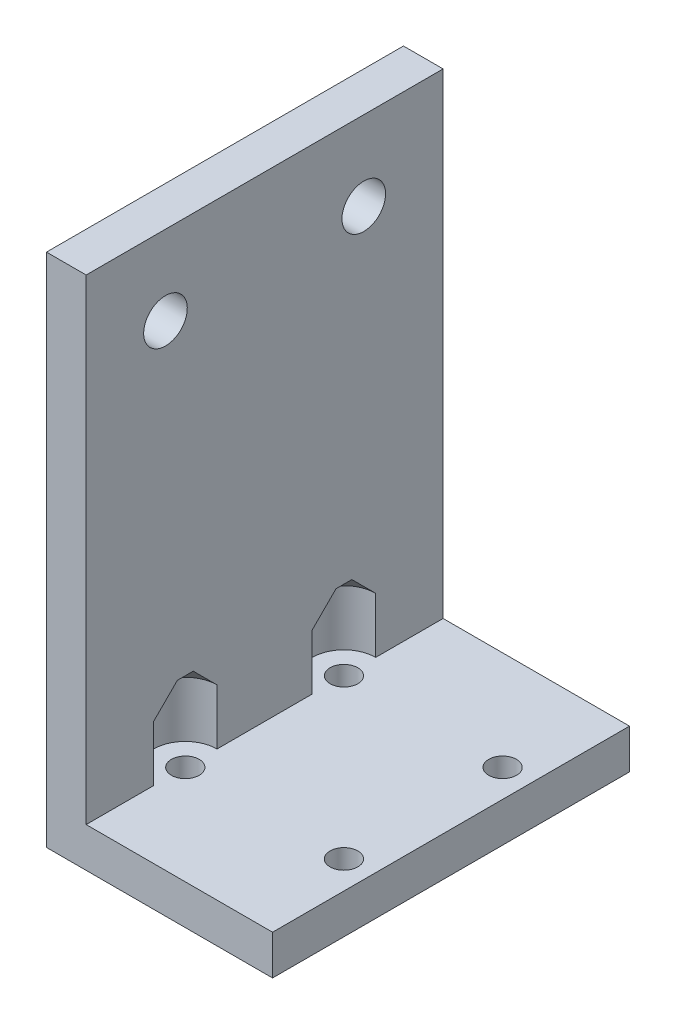
ISO-10303-21;
HEADER;
FILE_DESCRIPTION(('STEP AP214'),'2;1');
FILE_NAME('part.step','',(''),(''),'','','');
FILE_SCHEMA(('AUTOMOTIVE_DESIGN { 1 0 10303 214 1 1 1 1 }'));
ENDSEC;
DATA;
#1=APPLICATION_CONTEXT('core data for automotive mechanical design processes');
#2=APPLICATION_PROTOCOL_DEFINITION('international standard','automotive_design',2000,#1);
#3=PRODUCT_CONTEXT('',#1,'mechanical');
#4=PRODUCT('Part','Part','',(#3));
#5=PRODUCT_RELATED_PRODUCT_CATEGORY('part','',(#4));
#6=PRODUCT_DEFINITION_FORMATION('','',#4);
#7=PRODUCT_DEFINITION_CONTEXT('part definition',#1,'design');
#8=PRODUCT_DEFINITION('design','',#6,#7);
#9=PRODUCT_DEFINITION_SHAPE('','',#8);
#10=(LENGTH_UNIT() NAMED_UNIT(*) SI_UNIT(.MILLI.,.METRE.));
#11=(NAMED_UNIT(*) PLANE_ANGLE_UNIT() SI_UNIT($,.RADIAN.));
#12=(NAMED_UNIT(*) SI_UNIT($,.STERADIAN.) SOLID_ANGLE_UNIT());
#13=UNCERTAINTY_MEASURE_WITH_UNIT(LENGTH_MEASURE(1.E-05),#10,'distance_accuracy_value','');
#14=(GEOMETRIC_REPRESENTATION_CONTEXT(3) GLOBAL_UNCERTAINTY_ASSIGNED_CONTEXT((#13)) GLOBAL_UNIT_ASSIGNED_CONTEXT((#10,
#11,#12)) REPRESENTATION_CONTEXT('',''));
#15=CARTESIAN_POINT('',(0.,0.,0.));
#16=DIRECTION('',(0.,0.,1.));
#17=DIRECTION('',(1.,0.,0.));
#18=AXIS2_PLACEMENT_3D('',#15,#16,#17);
#19=CARTESIAN_POINT('',(-27.9131412078502,5.,45.));
#20=DIRECTION('',(-1.,0.,0.));
#21=DIRECTION('',(0.,-1.,0.));
#22=AXIS2_PLACEMENT_3D('',#19,#20,#21);
#23=PLANE('',#22);
#24=CARTESIAN_POINT('',(-27.9131412078502,55.,10.));
#25=DIRECTION('',(-1.,0.,0.));
#26=DIRECTION('',(0.,-1.,0.));
#27=AXIS2_PLACEMENT_3D('',#24,#25,#26);
#28=CIRCLE('',#27,2.75);
#29=CARTESIAN_POINT('',(-27.9131412078502,52.25,10.));
#30=VERTEX_POINT('',#29);
#31=EDGE_CURVE('E275',#30,#30,#28,.F.);
#32=ORIENTED_EDGE('',*,*,#31,.F.);
#33=EDGE_LOOP('',(#32));
#34=FACE_BOUND('',#33,.T.);
#35=CARTESIAN_POINT('',(-27.9131412078502,55.,35.));
#36=DIRECTION('',(-1.,0.,0.));
#37=DIRECTION('',(0.,-1.,0.));
#38=AXIS2_PLACEMENT_3D('',#35,#36,#37);
#39=CIRCLE('',#38,2.75);
#40=CARTESIAN_POINT('',(-27.9131412078502,52.25,35.));
#41=VERTEX_POINT('',#40);
#42=EDGE_CURVE('E268',#41,#41,#39,.F.);
#43=ORIENTED_EDGE('',*,*,#42,.F.);
#44=EDGE_LOOP('',(#43));
#45=FACE_BOUND('',#44,.T.);
#46=DIRECTION('',(0.,-1.,0.));
#47=VECTOR('',#46,1.);
#48=CARTESIAN_POINT('',(-27.9131412078502,15.,28.5));
#49=LINE('',#48,#47);
#50=CARTESIAN_POINT('',(-27.9131412078502,5.,28.5));
#51=VERTEX_POINT('',#50);
#52=CARTESIAN_POINT('',(-27.9131412078502,12.,28.5));
#53=VERTEX_POINT('',#52);
#54=EDGE_CURVE('E155',#51,#53,#49,.F.);
#55=ORIENTED_EDGE('',*,*,#54,.F.);
#56=DIRECTION('',(0.,0.,-1.));
#57=VECTOR('',#56,1.);
#58=CARTESIAN_POINT('',(-27.9131412078502,5.,45.));
#59=LINE('',#58,#57);
#60=CARTESIAN_POINT('',(-27.9131412078502,5.,16.5));
#61=VERTEX_POINT('',#60);
#62=EDGE_CURVE('E147',#51,#61,#59,.T.);
#63=ORIENTED_EDGE('',*,*,#62,.T.);
#64=DIRECTION('',(0.,-1.,0.));
#65=VECTOR('',#64,1.);
#66=CARTESIAN_POINT('',(-27.9131412078502,15.,16.5));
#67=LINE('',#66,#65);
#68=CARTESIAN_POINT('',(-27.9131412078502,12.,16.5));
#69=VERTEX_POINT('',#68);
#70=EDGE_CURVE('E128',#69,#61,#67,.T.);
#71=ORIENTED_EDGE('',*,*,#70,.F.);
#72=DIRECTION('',(0.,0.707106781186552,-0.707106781186543));
#73=VECTOR('',#72,1.);
#74=CARTESIAN_POINT('',(-27.9131412078502,16.,12.5));
#75=LINE('',#74,#73);
#76=CARTESIAN_POINT('',(-27.9131412078502,15.,13.5));
#77=VERTEX_POINT('',#76);
#78=EDGE_CURVE('E202',#69,#77,#75,.T.);
#79=ORIENTED_EDGE('',*,*,#78,.T.);
#80=DIRECTION('',(0.,0.,-1.));
#81=VECTOR('',#80,1.);
#82=CARTESIAN_POINT('',(-27.9131412078502,15.,45.));
#83=LINE('',#82,#81);
#84=CARTESIAN_POINT('',(-27.9131412078502,15.,11.5));
#85=VERTEX_POINT('',#84);
#86=EDGE_CURVE('E139',#77,#85,#83,.T.);
#87=ORIENTED_EDGE('',*,*,#86,.T.);
#88=DIRECTION('',(0.,-0.707106781186552,-0.707106781186543));
#89=VECTOR('',#88,1.);
#90=CARTESIAN_POINT('',(-27.9131412078502,16.,12.5));
#91=LINE('',#90,#89);
#92=CARTESIAN_POINT('',(-27.9131412078502,12.,8.50000000000001));
#93=VERTEX_POINT('',#92);
#94=EDGE_CURVE('E205',#85,#93,#91,.T.);
#95=ORIENTED_EDGE('',*,*,#94,.T.);
#96=DIRECTION('',(0.,-1.,0.));
#97=VECTOR('',#96,1.);
#98=CARTESIAN_POINT('',(-27.9131412078502,15.,8.50000000000001));
#99=LINE('',#98,#97);
#100=CARTESIAN_POINT('',(-27.9131412078502,5.,8.5));
#101=VERTEX_POINT('',#100);
#102=EDGE_CURVE('E138',#101,#93,#99,.F.);
#103=ORIENTED_EDGE('',*,*,#102,.F.);
#104=CARTESIAN_POINT('',(-27.9131412078502,5.,0.));
#105=VERTEX_POINT('',#104);
#106=EDGE_CURVE('E149',#101,#105,#59,.T.);
#107=ORIENTED_EDGE('',*,*,#106,.T.);
#108=DIRECTION('',(0.,1.,0.));
#109=VECTOR('',#108,1.);
#110=CARTESIAN_POINT('',(-27.9131412078502,5.,0.));
#111=LINE('',#110,#109);
#112=CARTESIAN_POINT('',(-27.9131412078502,65.,0.));
#113=VERTEX_POINT('',#112);
#114=EDGE_CURVE('E348',#105,#113,#111,.T.);
#115=ORIENTED_EDGE('',*,*,#114,.T.);
#116=DIRECTION('',(0.,0.,-1.));
#117=VECTOR('',#116,1.);
#118=CARTESIAN_POINT('',(-27.9131412078502,65.,45.));
#119=LINE('',#118,#117);
#120=CARTESIAN_POINT('',(-27.9131412078502,65.,45.));
#121=VERTEX_POINT('',#120);
#122=EDGE_CURVE('E163',#121,#113,#119,.T.);
#123=ORIENTED_EDGE('',*,*,#122,.F.);
#124=DIRECTION('',(0.,1.,0.));
#125=VECTOR('',#124,1.);
#126=CARTESIAN_POINT('',(-27.9131412078502,5.,45.));
#127=LINE('',#126,#125);
#128=CARTESIAN_POINT('',(-27.9131412078502,5.,45.));
#129=VERTEX_POINT('',#128);
#130=EDGE_CURVE('E329',#129,#121,#127,.T.);
#131=ORIENTED_EDGE('',*,*,#130,.F.);
#132=CARTESIAN_POINT('',(-27.9131412078502,5.,36.5));
#133=VERTEX_POINT('',#132);
#134=EDGE_CURVE('E157',#129,#133,#59,.T.);
#135=ORIENTED_EDGE('',*,*,#134,.T.);
#136=DIRECTION('',(0.,-1.,0.));
#137=VECTOR('',#136,1.);
#138=CARTESIAN_POINT('',(-27.9131412078502,15.,36.5));
#139=LINE('',#138,#137);
#140=CARTESIAN_POINT('',(-27.9131412078502,12.,36.5));
#141=VERTEX_POINT('',#140);
#142=EDGE_CURVE('E186',#141,#133,#139,.T.);
#143=ORIENTED_EDGE('',*,*,#142,.F.);
#144=DIRECTION('',(0.,0.707106781186552,-0.707106781186543));
#145=VECTOR('',#144,1.);
#146=CARTESIAN_POINT('',(-27.9131412078502,16.,32.5));
#147=LINE('',#146,#145);
#148=CARTESIAN_POINT('',(-27.9131412078502,15.,33.5));
#149=VERTEX_POINT('',#148);
#150=EDGE_CURVE('E49',#141,#149,#147,.T.);
#151=ORIENTED_EDGE('',*,*,#150,.T.);
#152=DIRECTION('',(0.,0.,-1.));
#153=VECTOR('',#152,1.);
#154=CARTESIAN_POINT('',(-27.9131412078502,15.,45.));
#155=LINE('',#154,#153);
#156=CARTESIAN_POINT('',(-27.9131412078502,15.,31.5));
#157=VERTEX_POINT('',#156);
#158=EDGE_CURVE('E183',#149,#157,#155,.T.);
#159=ORIENTED_EDGE('',*,*,#158,.T.);
#160=DIRECTION('',(0.,-0.707106781186552,-0.707106781186543));
#161=VECTOR('',#160,1.);
#162=CARTESIAN_POINT('',(-27.9131412078502,16.,32.5));
#163=LINE('',#162,#161);
#164=EDGE_CURVE('E11',#157,#53,#163,.T.);
#165=ORIENTED_EDGE('',*,*,#164,.T.);
#166=EDGE_LOOP('',(#55,#63,#71,#79,#87,#95,#103,#107,#115,#123,#131,#135,#143,#151,#159,#165));
#167=FACE_BOUND('',#166,.T.);
#168=ADVANCED_FACE('F40',(#34,#45,#167),#23,.F.);
#169=CARTESIAN_POINT('',(-32.9131412078502,65.,45.));
#170=DIRECTION('',(1.,0.,0.));
#171=DIRECTION('',(0.,1.,0.));
#172=AXIS2_PLACEMENT_3D('',#169,#170,#171);
#173=PLANE('',#172);
#174=CARTESIAN_POINT('',(-32.9131412078502,55.,10.));
#175=DIRECTION('',(-1.,0.,0.));
#176=DIRECTION('',(0.,-1.,0.));
#177=AXIS2_PLACEMENT_3D('',#174,#175,#176);
#178=CIRCLE('',#177,2.75);
#179=CARTESIAN_POINT('',(-32.9131412078502,52.25,10.));
#180=VERTEX_POINT('',#179);
#181=EDGE_CURVE('E271',#180,#180,#178,.T.);
#182=ORIENTED_EDGE('',*,*,#181,.F.);
#183=EDGE_LOOP('',(#182));
#184=FACE_BOUND('',#183,.T.);
#185=CARTESIAN_POINT('',(-32.9131412078502,55.,35.));
#186=DIRECTION('',(-1.,0.,0.));
#187=DIRECTION('',(0.,-1.,0.));
#188=AXIS2_PLACEMENT_3D('',#185,#186,#187);
#189=CIRCLE('',#188,2.75);
#190=CARTESIAN_POINT('',(-32.9131412078502,52.25,35.));
#191=VERTEX_POINT('',#190);
#192=EDGE_CURVE('E264',#191,#191,#189,.T.);
#193=ORIENTED_EDGE('',*,*,#192,.F.);
#194=EDGE_LOOP('',(#193));
#195=FACE_BOUND('',#194,.T.);
#196=DIRECTION('',(0.,-1.,0.));
#197=VECTOR('',#196,1.);
#198=CARTESIAN_POINT('',(-32.9131412078502,65.,0.));
#199=LINE('',#198,#197);
#200=CARTESIAN_POINT('',(-32.9131412078502,65.,0.));
#201=VERTEX_POINT('',#200);
#202=CARTESIAN_POINT('',(-32.9131412078502,0.,0.));
#203=VERTEX_POINT('',#202);
#204=EDGE_CURVE('E314',#201,#203,#199,.T.);
#205=ORIENTED_EDGE('',*,*,#204,.T.);
#206=DIRECTION('',(0.,0.,-1.));
#207=VECTOR('',#206,1.);
#208=CARTESIAN_POINT('',(-32.9131412078502,0.,45.));
#209=LINE('',#208,#207);
#210=CARTESIAN_POINT('',(-32.9131412078502,0.,45.));
#211=VERTEX_POINT('',#210);
#212=EDGE_CURVE('E174',#211,#203,#209,.T.);
#213=ORIENTED_EDGE('',*,*,#212,.F.);
#214=DIRECTION('',(0.,-1.,0.));
#215=VECTOR('',#214,1.);
#216=CARTESIAN_POINT('',(-32.9131412078502,65.,45.));
#217=LINE('',#216,#215);
#218=CARTESIAN_POINT('',(-32.9131412078502,65.,45.));
#219=VERTEX_POINT('',#218);
#220=EDGE_CURVE('E315',#219,#211,#217,.T.);
#221=ORIENTED_EDGE('',*,*,#220,.F.);
#222=DIRECTION('',(0.,0.,-1.));
#223=VECTOR('',#222,1.);
#224=CARTESIAN_POINT('',(-32.9131412078502,65.,45.));
#225=LINE('',#224,#223);
#226=EDGE_CURVE('E335',#219,#201,#225,.T.);
#227=ORIENTED_EDGE('',*,*,#226,.T.);
#228=EDGE_LOOP('',(#205,#213,#221,#227));
#229=FACE_BOUND('',#228,.T.);
#230=ADVANCED_FACE('F228',(#184,#195,#229),#173,.F.);
#231=CARTESIAN_POINT('',(-32.9131412078502,0.,45.));
#232=DIRECTION('',(0.,1.,0.));
#233=DIRECTION('',(0.,0.,1.));
#234=AXIS2_PLACEMENT_3D('',#231,#232,#233);
#235=PLANE('',#234);
#236=CARTESIAN_POINT('',(-7.91314120785022,0.,32.5));
#237=DIRECTION('',(0.,1.,0.));
#238=DIRECTION('',(0.,0.,1.));
#239=AXIS2_PLACEMENT_3D('',#236,#237,#238);
#240=CIRCLE('',#239,1.75);
#241=CARTESIAN_POINT('',(-7.91314120785022,0.,34.25));
#242=VERTEX_POINT('',#241);
#243=EDGE_CURVE('E297',#242,#242,#240,.F.);
#244=ORIENTED_EDGE('',*,*,#243,.F.);
#245=EDGE_LOOP('',(#244));
#246=FACE_BOUND('',#245,.T.);
#247=CARTESIAN_POINT('',(-7.91314120785022,0.,12.5));
#248=DIRECTION('',(0.,1.,0.));
#249=DIRECTION('',(0.,0.,1.));
#250=AXIS2_PLACEMENT_3D('',#247,#248,#249);
#251=CIRCLE('',#250,1.75);
#252=CARTESIAN_POINT('',(-7.91314120785022,0.,14.25));
#253=VERTEX_POINT('',#252);
#254=EDGE_CURVE('E288',#253,#253,#251,.F.);
#255=ORIENTED_EDGE('',*,*,#254,.F.);
#256=EDGE_LOOP('',(#255));
#257=FACE_BOUND('',#256,.T.);
#258=CARTESIAN_POINT('',(-27.9131412078502,0.,12.5));
#259=DIRECTION('',(0.,1.,0.));
#260=DIRECTION('',(0.,0.,1.));
#261=AXIS2_PLACEMENT_3D('',#258,#259,#260);
#262=CIRCLE('',#261,1.75);
#263=CARTESIAN_POINT('',(-27.9131412078502,0.,14.25));
#264=VERTEX_POINT('',#263);
#265=EDGE_CURVE('E287',#264,#264,#262,.F.);
#266=ORIENTED_EDGE('',*,*,#265,.F.);
#267=EDGE_LOOP('',(#266));
#268=FACE_BOUND('',#267,.T.);
#269=CARTESIAN_POINT('',(-27.9131412078502,0.,32.5));
#270=DIRECTION('',(0.,1.,0.));
#271=DIRECTION('',(0.,0.,1.));
#272=AXIS2_PLACEMENT_3D('',#269,#270,#271);
#273=CIRCLE('',#272,1.75);
#274=CARTESIAN_POINT('',(-27.9131412078502,0.,34.25));
#275=VERTEX_POINT('',#274);
#276=EDGE_CURVE('E310',#275,#275,#273,.F.);
#277=ORIENTED_EDGE('',*,*,#276,.F.);
#278=EDGE_LOOP('',(#277));
#279=FACE_BOUND('',#278,.T.);
#280=DIRECTION('',(1.,0.,0.));
#281=VECTOR('',#280,1.);
#282=CARTESIAN_POINT('',(-32.9131412078502,0.,0.));
#283=LINE('',#282,#281);
#284=CARTESIAN_POINT('',(-4.41314120785022,0.,0.));
#285=VERTEX_POINT('',#284);
#286=EDGE_CURVE('E339',#203,#285,#283,.T.);
#287=ORIENTED_EDGE('',*,*,#286,.T.);
#288=DIRECTION('',(0.,0.,-1.));
#289=VECTOR('',#288,1.);
#290=CARTESIAN_POINT('',(-4.41314120785022,0.,45.));
#291=LINE('',#290,#289);
#292=CARTESIAN_POINT('',(-4.41314120785022,0.,45.));
#293=VERTEX_POINT('',#292);
#294=EDGE_CURVE('E170',#293,#285,#291,.T.);
#295=ORIENTED_EDGE('',*,*,#294,.F.);
#296=DIRECTION('',(1.,0.,0.));
#297=VECTOR('',#296,1.);
#298=CARTESIAN_POINT('',(-32.9131412078502,0.,45.));
#299=LINE('',#298,#297);
#300=EDGE_CURVE('E319',#211,#293,#299,.T.);
#301=ORIENTED_EDGE('',*,*,#300,.F.);
#302=ORIENTED_EDGE('',*,*,#212,.T.);
#303=EDGE_LOOP('',(#287,#295,#301,#302));
#304=FACE_BOUND('',#303,.T.);
#305=ADVANCED_FACE('F234',(#246,#257,#268,#279,#304),#235,.F.);
#306=CARTESIAN_POINT('',(-4.41314120785022,0.,45.));
#307=DIRECTION('',(-1.,0.,0.));
#308=DIRECTION('',(0.,0.,1.));
#309=AXIS2_PLACEMENT_3D('',#306,#307,#308);
#310=PLANE('',#309);
#311=DIRECTION('',(0.,1.,0.));
#312=VECTOR('',#311,1.);
#313=CARTESIAN_POINT('',(-4.41314120785022,0.,0.));
#314=LINE('',#313,#312);
#315=CARTESIAN_POINT('',(-4.41314120785022,5.,0.));
#316=VERTEX_POINT('',#315);
#317=EDGE_CURVE('E342',#285,#316,#314,.T.);
#318=ORIENTED_EDGE('',*,*,#317,.T.);
#319=DIRECTION('',(0.,0.,-1.));
#320=VECTOR('',#319,1.);
#321=CARTESIAN_POINT('',(-4.41314120785022,5.,45.));
#322=LINE('',#321,#320);
#323=CARTESIAN_POINT('',(-4.41314120785022,5.,45.));
#324=VERTEX_POINT('',#323);
#325=EDGE_CURVE('E162',#324,#316,#322,.T.);
#326=ORIENTED_EDGE('',*,*,#325,.F.);
#327=DIRECTION('',(0.,1.,0.));
#328=VECTOR('',#327,1.);
#329=CARTESIAN_POINT('',(-4.41314120785022,0.,45.));
#330=LINE('',#329,#328);
#331=EDGE_CURVE('E323',#293,#324,#330,.T.);
#332=ORIENTED_EDGE('',*,*,#331,.F.);
#333=ORIENTED_EDGE('',*,*,#294,.T.);
#334=EDGE_LOOP('',(#318,#326,#332,#333));
#335=FACE_BOUND('',#334,.T.);
#336=ADVANCED_FACE('F245',(#335),#310,.F.);
#337=CARTESIAN_POINT('',(-4.41314120785022,5.,45.));
#338=DIRECTION('',(0.,-1.,0.));
#339=DIRECTION('',(1.,0.,0.));
#340=AXIS2_PLACEMENT_3D('',#337,#338,#339);
#341=PLANE('',#340);
#342=ORIENTED_EDGE('',*,*,#62,.F.);
#343=CARTESIAN_POINT('',(-27.9131412078502,5.,32.5));
#344=DIRECTION('',(0.,1.,0.));
#345=DIRECTION('',(-1.,0.,0.));
#346=AXIS2_PLACEMENT_3D('',#343,#344,#345);
#347=CIRCLE('',#346,4.);
#348=EDGE_CURVE('E151',#51,#133,#347,.T.);
#349=ORIENTED_EDGE('',*,*,#348,.T.);
#350=ORIENTED_EDGE('',*,*,#134,.F.);
#351=DIRECTION('',(-1.,0.,0.));
#352=VECTOR('',#351,1.);
#353=CARTESIAN_POINT('',(-4.41314120785022,5.,45.));
#354=LINE('',#353,#352);
#355=EDGE_CURVE('E326',#324,#129,#354,.T.);
#356=ORIENTED_EDGE('',*,*,#355,.F.);
#357=ORIENTED_EDGE('',*,*,#325,.T.);
#358=DIRECTION('',(-1.,0.,0.));
#359=VECTOR('',#358,1.);
#360=CARTESIAN_POINT('',(-4.41314120785022,5.,0.));
#361=LINE('',#360,#359);
#362=EDGE_CURVE('E345',#316,#105,#361,.T.);
#363=ORIENTED_EDGE('',*,*,#362,.T.);
#364=ORIENTED_EDGE('',*,*,#106,.F.);
#365=CARTESIAN_POINT('',(-27.9131412078502,5.,12.5));
#366=DIRECTION('',(0.,1.,0.));
#367=DIRECTION('',(-1.,0.,0.));
#368=AXIS2_PLACEMENT_3D('',#365,#366,#367);
#369=CIRCLE('',#368,4.);
#370=EDGE_CURVE('E132',#101,#61,#369,.T.);
#371=ORIENTED_EDGE('',*,*,#370,.T.);
#372=EDGE_LOOP('',(#342,#349,#350,#356,#357,#363,#364,#371));
#373=FACE_BOUND('',#372,.T.);
#374=CARTESIAN_POINT('',(-7.91314120785022,5.,32.5));
#375=DIRECTION('',(0.,1.,0.));
#376=DIRECTION('',(-1.,0.,0.));
#377=AXIS2_PLACEMENT_3D('',#374,#375,#376);
#378=CIRCLE('',#377,1.75);
#379=CARTESIAN_POINT('',(-9.66314120785022,5.,32.5));
#380=VERTEX_POINT('',#379);
#381=EDGE_CURVE('E278',#380,#380,#378,.T.);
#382=ORIENTED_EDGE('',*,*,#381,.F.);
#383=EDGE_LOOP('',(#382));
#384=FACE_BOUND('',#383,.T.);
#385=CARTESIAN_POINT('',(-7.91314120785022,5.,12.5));
#386=DIRECTION('',(0.,1.,0.));
#387=DIRECTION('',(-1.,0.,0.));
#388=AXIS2_PLACEMENT_3D('',#385,#386,#387);
#389=CIRCLE('',#388,1.75);
#390=CARTESIAN_POINT('',(-9.66314120785022,5.,12.5));
#391=VERTEX_POINT('',#390);
#392=EDGE_CURVE('E293',#391,#391,#389,.T.);
#393=ORIENTED_EDGE('',*,*,#392,.F.);
#394=EDGE_LOOP('',(#393));
#395=FACE_BOUND('',#394,.T.);
#396=CARTESIAN_POINT('',(-27.9131412078502,5.,12.5));
#397=DIRECTION('',(0.,1.,0.));
#398=DIRECTION('',(-1.,0.,0.));
#399=AXIS2_PLACEMENT_3D('',#396,#397,#398);
#400=CIRCLE('',#399,1.75);
#401=CARTESIAN_POINT('',(-29.6631412078502,5.,12.5));
#402=VERTEX_POINT('',#401);
#403=EDGE_CURVE('E283',#402,#402,#400,.T.);
#404=ORIENTED_EDGE('',*,*,#403,.F.);
#405=EDGE_LOOP('',(#404));
#406=FACE_BOUND('',#405,.T.);
#407=CARTESIAN_POINT('',(-27.9131412078502,5.,32.5));
#408=DIRECTION('',(0.,1.,0.));
#409=DIRECTION('',(-1.,0.,0.));
#410=AXIS2_PLACEMENT_3D('',#407,#408,#409);
#411=CIRCLE('',#410,1.75);
#412=CARTESIAN_POINT('',(-29.6631412078502,5.,32.5));
#413=VERTEX_POINT('',#412);
#414=EDGE_CURVE('E292',#413,#413,#411,.T.);
#415=ORIENTED_EDGE('',*,*,#414,.F.);
#416=EDGE_LOOP('',(#415));
#417=FACE_BOUND('',#416,.T.);
#418=ADVANCED_FACE('F144',(#373,#384,#395,#406,#417),#341,.F.);
#419=CARTESIAN_POINT('',(-27.9131412078502,65.,45.));
#420=DIRECTION('',(0.,-1.,0.));
#421=DIRECTION('',(0.,0.,-1.));
#422=AXIS2_PLACEMENT_3D('',#419,#420,#421);
#423=PLANE('',#422);
#424=DIRECTION('',(-1.,0.,0.));
#425=VECTOR('',#424,1.);
#426=CARTESIAN_POINT('',(-27.9131412078502,65.,0.));
#427=LINE('',#426,#425);
#428=EDGE_CURVE('E320',#113,#201,#427,.T.);
#429=ORIENTED_EDGE('',*,*,#428,.T.);
#430=ORIENTED_EDGE('',*,*,#226,.F.);
#431=DIRECTION('',(-1.,0.,0.));
#432=VECTOR('',#431,1.);
#433=CARTESIAN_POINT('',(-27.9131412078502,65.,45.));
#434=LINE('',#433,#432);
#435=EDGE_CURVE('E332',#121,#219,#434,.T.);
#436=ORIENTED_EDGE('',*,*,#435,.F.);
#437=ORIENTED_EDGE('',*,*,#122,.T.);
#438=EDGE_LOOP('',(#429,#430,#436,#437));
#439=FACE_BOUND('',#438,.T.);
#440=ADVANCED_FACE('F241',(#439),#423,.F.);
#441=CARTESIAN_POINT('',(0.,0.,45.));
#442=DIRECTION('',(0.,0.,1.));
#443=DIRECTION('',(1.,0.,0.));
#444=AXIS2_PLACEMENT_3D('',#441,#442,#443);
#445=PLANE('',#444);
#446=ORIENTED_EDGE('',*,*,#220,.T.);
#447=ORIENTED_EDGE('',*,*,#300,.T.);
#448=ORIENTED_EDGE('',*,*,#331,.T.);
#449=ORIENTED_EDGE('',*,*,#355,.T.);
#450=ORIENTED_EDGE('',*,*,#130,.T.);
#451=ORIENTED_EDGE('',*,*,#435,.T.);
#452=EDGE_LOOP('',(#446,#447,#448,#449,#450,#451));
#453=FACE_BOUND('',#452,.T.);
#454=ADVANCED_FACE('F375',(#453),#445,.T.);
#455=CARTESIAN_POINT('',(0.,0.,0.));
#456=DIRECTION('',(0.,0.,1.));
#457=DIRECTION('',(1.,0.,0.));
#458=AXIS2_PLACEMENT_3D('',#455,#456,#457);
#459=PLANE('',#458);
#460=ORIENTED_EDGE('',*,*,#204,.F.);
#461=ORIENTED_EDGE('',*,*,#428,.F.);
#462=ORIENTED_EDGE('',*,*,#114,.F.);
#463=ORIENTED_EDGE('',*,*,#362,.F.);
#464=ORIENTED_EDGE('',*,*,#317,.F.);
#465=ORIENTED_EDGE('',*,*,#286,.F.);
#466=EDGE_LOOP('',(#460,#461,#462,#463,#464,#465));
#467=FACE_BOUND('',#466,.T.);
#468=ADVANCED_FACE('F367',(#467),#459,.F.);
#469=CARTESIAN_POINT('',(-27.9131412078502,-0.0010000000000036,32.5));
#470=DIRECTION('',(0.,1.,0.));
#471=DIRECTION('',(-1.,0.,0.));
#472=AXIS2_PLACEMENT_3D('',#469,#470,#471);
#473=CYLINDRICAL_SURFACE('',#472,1.75);
#474=ORIENTED_EDGE('',*,*,#414,.T.);
#475=EDGE_LOOP('',(#474));
#476=FACE_BOUND('',#475,.T.);
#477=ORIENTED_EDGE('',*,*,#276,.T.);
#478=EDGE_LOOP('',(#477));
#479=FACE_BOUND('',#478,.T.);
#480=ADVANCED_FACE('F384',(#476,#479),#473,.F.);
#481=CARTESIAN_POINT('',(-27.9131412078502,-0.0010000000000036,12.5));
#482=DIRECTION('',(0.,1.,0.));
#483=DIRECTION('',(-1.,0.,0.));
#484=AXIS2_PLACEMENT_3D('',#481,#482,#483);
#485=CYLINDRICAL_SURFACE('',#484,1.75);
#486=ORIENTED_EDGE('',*,*,#403,.T.);
#487=EDGE_LOOP('',(#486));
#488=FACE_BOUND('',#487,.T.);
#489=ORIENTED_EDGE('',*,*,#265,.T.);
#490=EDGE_LOOP('',(#489));
#491=FACE_BOUND('',#490,.T.);
#492=ADVANCED_FACE('F388',(#488,#491),#485,.F.);
#493=CARTESIAN_POINT('',(-7.91314120785022,-0.001000000000001,12.5));
#494=DIRECTION('',(0.,1.,0.));
#495=DIRECTION('',(-1.,0.,0.));
#496=AXIS2_PLACEMENT_3D('',#493,#494,#495);
#497=CYLINDRICAL_SURFACE('',#496,1.75);
#498=ORIENTED_EDGE('',*,*,#392,.T.);
#499=EDGE_LOOP('',(#498));
#500=FACE_BOUND('',#499,.T.);
#501=ORIENTED_EDGE('',*,*,#254,.T.);
#502=EDGE_LOOP('',(#501));
#503=FACE_BOUND('',#502,.T.);
#504=ADVANCED_FACE('F394',(#500,#503),#497,.F.);
#505=CARTESIAN_POINT('',(-7.91314120785022,-0.001000000000001,32.5));
#506=DIRECTION('',(0.,1.,0.));
#507=DIRECTION('',(-1.,0.,0.));
#508=AXIS2_PLACEMENT_3D('',#505,#506,#507);
#509=CYLINDRICAL_SURFACE('',#508,1.75);
#510=ORIENTED_EDGE('',*,*,#381,.T.);
#511=EDGE_LOOP('',(#510));
#512=FACE_BOUND('',#511,.T.);
#513=ORIENTED_EDGE('',*,*,#243,.T.);
#514=EDGE_LOOP('',(#513));
#515=FACE_BOUND('',#514,.T.);
#516=ADVANCED_FACE('F390',(#512,#515),#509,.F.);
#517=CARTESIAN_POINT('',(-4.41214120785021,55.,35.));
#518=DIRECTION('',(-1.,0.,0.));
#519=DIRECTION('',(0.,-1.,0.));
#520=AXIS2_PLACEMENT_3D('',#517,#518,#519);
#521=CYLINDRICAL_SURFACE('',#520,2.75);
#522=ORIENTED_EDGE('',*,*,#192,.T.);
#523=EDGE_LOOP('',(#522));
#524=FACE_BOUND('',#523,.T.);
#525=ORIENTED_EDGE('',*,*,#42,.T.);
#526=EDGE_LOOP('',(#525));
#527=FACE_BOUND('',#526,.T.);
#528=ADVANCED_FACE('F393',(#524,#527),#521,.F.);
#529=CARTESIAN_POINT('',(-4.41214120785021,55.,10.));
#530=DIRECTION('',(-1.,0.,0.));
#531=DIRECTION('',(0.,-1.,0.));
#532=AXIS2_PLACEMENT_3D('',#529,#530,#531);
#533=CYLINDRICAL_SURFACE('',#532,2.75);
#534=ORIENTED_EDGE('',*,*,#181,.T.);
#535=EDGE_LOOP('',(#534));
#536=FACE_BOUND('',#535,.T.);
#537=ORIENTED_EDGE('',*,*,#31,.T.);
#538=EDGE_LOOP('',(#537));
#539=FACE_BOUND('',#538,.T.);
#540=ADVANCED_FACE('F225',(#536,#539),#533,.F.);
#541=CARTESIAN_POINT('',(-27.9131412078502,15.,12.5));
#542=DIRECTION('',(0.,-1.,0.));
#543=DIRECTION('',(1.,0.,0.));
#544=AXIS2_PLACEMENT_3D('',#541,#542,#543);
#545=CYLINDRICAL_SURFACE('',#544,4.);
#546=ORIENTED_EDGE('',*,*,#102,.T.);
#547=CARTESIAN_POINT('',(-27.9131412078502,12.,12.5));
#548=DIRECTION('',(0.,1.,0.));
#549=DIRECTION('',(0.,0.,1.));
#550=AXIS2_PLACEMENT_3D('',#547,#548,#549);
#551=CIRCLE('',#550,4.);
#552=EDGE_CURVE('E135',#93,#69,#551,.T.);
#553=ORIENTED_EDGE('',*,*,#552,.T.);
#554=ORIENTED_EDGE('',*,*,#70,.T.);
#555=ORIENTED_EDGE('',*,*,#370,.F.);
#556=EDGE_LOOP('',(#546,#553,#554,#555));
#557=FACE_BOUND('',#556,.T.);
#558=ADVANCED_FACE('F131',(#557),#545,.F.);
#559=CARTESIAN_POINT('',(-27.9131412078502,15.,12.5));
#560=DIRECTION('',(0.,1.,0.));
#561=DIRECTION('',(-1.,0.,0.));
#562=AXIS2_PLACEMENT_3D('',#559,#560,#561);
#563=PLANE('',#562);
#564=ORIENTED_EDGE('',*,*,#86,.F.);
#565=CARTESIAN_POINT('',(-27.9131412078502,15.,12.5));
#566=DIRECTION('',(0.,1.,0.));
#567=DIRECTION('',(-1.,0.,0.));
#568=AXIS2_PLACEMENT_3D('',#565,#566,#567);
#569=CIRCLE('',#568,0.999999999999994);
#570=EDGE_CURVE('E193',#77,#85,#569,.F.);
#571=ORIENTED_EDGE('',*,*,#570,.T.);
#572=EDGE_LOOP('',(#564,#571));
#573=FACE_BOUND('',#572,.T.);
#574=ADVANCED_FACE('F214',(#573),#563,.F.);
#575=CARTESIAN_POINT('',(-27.9131412078502,15.,32.5));
#576=DIRECTION('',(0.,-1.,0.));
#577=DIRECTION('',(1.,0.,0.));
#578=AXIS2_PLACEMENT_3D('',#575,#576,#577);
#579=CYLINDRICAL_SURFACE('',#578,4.);
#580=ORIENTED_EDGE('',*,*,#54,.T.);
#581=CARTESIAN_POINT('',(-27.9131412078502,12.,32.5));
#582=DIRECTION('',(0.,1.,0.));
#583=DIRECTION('',(0.,0.,1.));
#584=AXIS2_PLACEMENT_3D('',#581,#582,#583);
#585=CIRCLE('',#584,4.);
#586=EDGE_CURVE('E196',#53,#141,#585,.T.);
#587=ORIENTED_EDGE('',*,*,#586,.T.);
#588=ORIENTED_EDGE('',*,*,#142,.T.);
#589=ORIENTED_EDGE('',*,*,#348,.F.);
#590=EDGE_LOOP('',(#580,#587,#588,#589));
#591=FACE_BOUND('',#590,.T.);
#592=ADVANCED_FACE('F216',(#591),#579,.F.);
#593=CARTESIAN_POINT('',(-27.9131412078502,15.,32.5));
#594=DIRECTION('',(0.,1.,0.));
#595=DIRECTION('',(-1.,0.,0.));
#596=AXIS2_PLACEMENT_3D('',#593,#594,#595);
#597=PLANE('',#596);
#598=ORIENTED_EDGE('',*,*,#158,.F.);
#599=CARTESIAN_POINT('',(-27.9131412078502,15.,32.5));
#600=DIRECTION('',(0.,1.,0.));
#601=DIRECTION('',(-1.,0.,0.));
#602=AXIS2_PLACEMENT_3D('',#599,#600,#601);
#603=CIRCLE('',#602,0.999999999999994);
#604=EDGE_CURVE('E55',#149,#157,#603,.F.);
#605=ORIENTED_EDGE('',*,*,#604,.T.);
#606=EDGE_LOOP('',(#598,#605));
#607=FACE_BOUND('',#606,.T.);
#608=ADVANCED_FACE('F222',(#607),#597,.F.);
#609=CARTESIAN_POINT('',(-27.9131412078502,12.,12.5));
#610=DIRECTION('',(0.,-1.,0.));
#611=DIRECTION('',(0.,0.,-1.));
#612=AXIS2_PLACEMENT_3D('',#609,#610,#611);
#613=CONICAL_SURFACE('',#612,4.,0.785398163397442);
#614=ORIENTED_EDGE('',*,*,#94,.F.);
#615=ORIENTED_EDGE('',*,*,#570,.F.);
#616=ORIENTED_EDGE('',*,*,#78,.F.);
#617=ORIENTED_EDGE('',*,*,#552,.F.);
#618=EDGE_LOOP('',(#614,#615,#616,#617));
#619=FACE_BOUND('',#618,.T.);
#620=ADVANCED_FACE('F212',(#619),#613,.F.);
#621=CARTESIAN_POINT('',(-27.9131412078502,12.,32.5));
#622=DIRECTION('',(0.,-1.,0.));
#623=DIRECTION('',(0.,0.,-1.));
#624=AXIS2_PLACEMENT_3D('',#621,#622,#623);
#625=CONICAL_SURFACE('',#624,4.,0.785398163397443);
#626=ORIENTED_EDGE('',*,*,#164,.F.);
#627=ORIENTED_EDGE('',*,*,#604,.F.);
#628=ORIENTED_EDGE('',*,*,#150,.F.);
#629=ORIENTED_EDGE('',*,*,#586,.F.);
#630=EDGE_LOOP('',(#626,#627,#628,#629));
#631=FACE_BOUND('',#630,.T.);
#632=ADVANCED_FACE('F42',(#631),#625,.F.);
#633=CLOSED_SHELL('',(#168,#230,#305,#336,#418,#440,#454,#468,#480,#492,#504,#516,#528,#540,
#558,#574,#592,#608,#620,#632));
#634=MANIFOLD_SOLID_BREP('B2',#633);
#635=ADVANCED_BREP_SHAPE_REPRESENTATION('',(#18,#634),#14);
#636=SHAPE_DEFINITION_REPRESENTATION(#9,#635);
ENDSEC;
END-ISO-10303-21;
